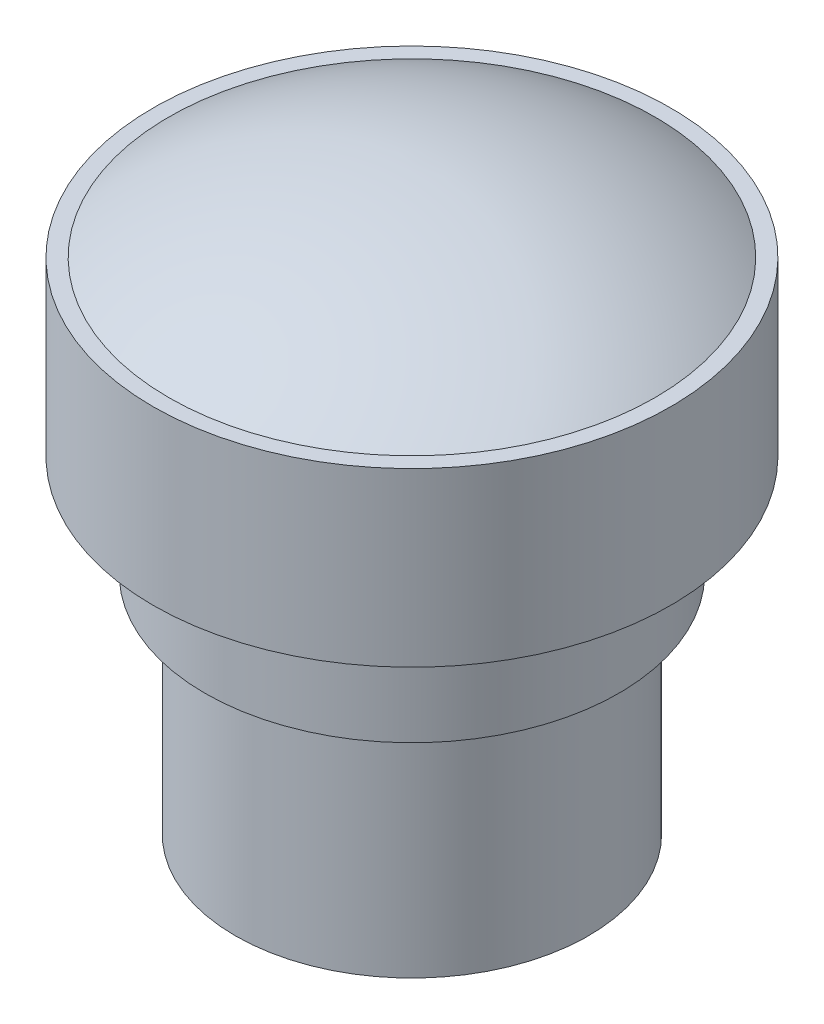
ISO-10303-21;
HEADER;
FILE_DESCRIPTION(('STEP AP214'),'2;1');
FILE_NAME('part.step','',(''),(''),'','','');
FILE_SCHEMA(('AUTOMOTIVE_DESIGN { 1 0 10303 214 1 1 1 1 }'));
ENDSEC;
DATA;
#1=APPLICATION_CONTEXT('core data for automotive mechanical design processes');
#2=APPLICATION_PROTOCOL_DEFINITION('international standard','automotive_design',2000,#1);
#3=PRODUCT_CONTEXT('',#1,'mechanical');
#4=PRODUCT('Part','Part','',(#3));
#5=PRODUCT_RELATED_PRODUCT_CATEGORY('part','',(#4));
#6=PRODUCT_DEFINITION_FORMATION('','',#4);
#7=PRODUCT_DEFINITION_CONTEXT('part definition',#1,'design');
#8=PRODUCT_DEFINITION('design','',#6,#7);
#9=PRODUCT_DEFINITION_SHAPE('','',#8);
#10=(LENGTH_UNIT() NAMED_UNIT(*) SI_UNIT(.MILLI.,.METRE.));
#11=(NAMED_UNIT(*) PLANE_ANGLE_UNIT() SI_UNIT($,.RADIAN.));
#12=(NAMED_UNIT(*) SI_UNIT($,.STERADIAN.) SOLID_ANGLE_UNIT());
#13=UNCERTAINTY_MEASURE_WITH_UNIT(LENGTH_MEASURE(1.E-05),#10,'distance_accuracy_value','');
#14=(GEOMETRIC_REPRESENTATION_CONTEXT(3) GLOBAL_UNCERTAINTY_ASSIGNED_CONTEXT((#13)) GLOBAL_UNIT_ASSIGNED_CONTEXT((#10,
#11,#12)) REPRESENTATION_CONTEXT('',''));
#15=CARTESIAN_POINT('',(0.,0.,0.));
#16=DIRECTION('',(0.,0.,1.));
#17=DIRECTION('',(1.,0.,0.));
#18=AXIS2_PLACEMENT_3D('',#15,#16,#17);
#19=CARTESIAN_POINT('',(0.,0.,0.));
#20=DIRECTION('',(0.,1.,0.));
#21=DIRECTION('',(0.,0.,1.));
#22=AXIS2_PLACEMENT_3D('',#19,#20,#21);
#23=PLANE('',#22);
#24=CARTESIAN_POINT('',(0.,0.,0.));
#25=DIRECTION('',(0.,1.,0.));
#26=DIRECTION('',(0.,0.,1.));
#27=AXIS2_PLACEMENT_3D('',#24,#25,#26);
#28=CIRCLE('',#27,5.8);
#29=CARTESIAN_POINT('',(0.,0.,5.8));
#30=VERTEX_POINT('',#29);
#31=EDGE_CURVE('E10',#30,#30,#28,.T.);
#32=ORIENTED_EDGE('',*,*,#31,.F.);
#33=EDGE_LOOP('',(#32));
#34=FACE_BOUND('',#33,.T.);
#35=ADVANCED_FACE('F41',(#34),#23,.F.);
#36=CARTESIAN_POINT('',(0.,18.9,0.));
#37=DIRECTION('',(0.,1.,0.));
#38=DIRECTION('',(0.,0.,1.));
#39=AXIS2_PLACEMENT_3D('',#36,#37,#38);
#40=CYLINDRICAL_SURFACE('',#39,5.8);
#41=CARTESIAN_POINT('',(0.,7.4,0.));
#42=DIRECTION('',(0.,1.,0.));
#43=DIRECTION('',(0.,0.,1.));
#44=AXIS2_PLACEMENT_3D('',#41,#42,#43);
#45=CIRCLE('',#44,5.8);
#46=CARTESIAN_POINT('',(0.,7.4,5.8));
#47=VERTEX_POINT('',#46);
#48=EDGE_CURVE('E47',#47,#47,#45,.T.);
#49=ORIENTED_EDGE('',*,*,#48,.F.);
#50=EDGE_LOOP('',(#49));
#51=FACE_BOUND('',#50,.T.);
#52=ORIENTED_EDGE('',*,*,#31,.T.);
#53=EDGE_LOOP('',(#52));
#54=FACE_BOUND('',#53,.T.);
#55=ADVANCED_FACE('F98',(#51,#54),#40,.T.);
#56=CARTESIAN_POINT('',(5.8,7.4,0.));
#57=DIRECTION('',(0.,1.,0.));
#58=DIRECTION('',(0.,0.,1.));
#59=AXIS2_PLACEMENT_3D('',#56,#57,#58);
#60=PLANE('',#59);
#61=CARTESIAN_POINT('',(0.,7.4,0.));
#62=DIRECTION('',(0.,1.,0.));
#63=DIRECTION('',(0.,0.,1.));
#64=AXIS2_PLACEMENT_3D('',#61,#62,#63);
#65=CIRCLE('',#64,6.8);
#66=CARTESIAN_POINT('',(0.,7.4,6.8));
#67=VERTEX_POINT('',#66);
#68=EDGE_CURVE('E51',#67,#67,#65,.T.);
#69=ORIENTED_EDGE('',*,*,#68,.F.);
#70=EDGE_LOOP('',(#69));
#71=FACE_BOUND('',#70,.T.);
#72=ORIENTED_EDGE('',*,*,#48,.T.);
#73=EDGE_LOOP('',(#72));
#74=FACE_BOUND('',#73,.T.);
#75=ADVANCED_FACE('F93',(#71,#74),#60,.F.);
#76=CARTESIAN_POINT('',(0.,18.9,0.));
#77=DIRECTION('',(0.,1.,0.));
#78=DIRECTION('',(0.,0.,1.));
#79=AXIS2_PLACEMENT_3D('',#76,#77,#78);
#80=CYLINDRICAL_SURFACE('',#79,6.8);
#81=CARTESIAN_POINT('',(0.,10.75,0.));
#82=DIRECTION('',(0.,1.,0.));
#83=DIRECTION('',(0.,0.,1.));
#84=AXIS2_PLACEMENT_3D('',#81,#82,#83);
#85=CIRCLE('',#84,6.8);
#86=CARTESIAN_POINT('',(0.,10.75,6.8));
#87=VERTEX_POINT('',#86);
#88=EDGE_CURVE('E55',#87,#87,#85,.T.);
#89=ORIENTED_EDGE('',*,*,#88,.F.);
#90=EDGE_LOOP('',(#89));
#91=FACE_BOUND('',#90,.T.);
#92=ORIENTED_EDGE('',*,*,#68,.T.);
#93=EDGE_LOOP('',(#92));
#94=FACE_BOUND('',#93,.T.);
#95=ADVANCED_FACE('F87',(#91,#94),#80,.T.);
#96=CARTESIAN_POINT('',(6.8,10.75,0.));
#97=DIRECTION('',(0.,1.,0.));
#98=DIRECTION('',(0.,0.,1.));
#99=AXIS2_PLACEMENT_3D('',#96,#97,#98);
#100=PLANE('',#99);
#101=CARTESIAN_POINT('',(0.,10.75,0.));
#102=DIRECTION('',(0.,1.,0.));
#103=DIRECTION('',(0.,0.,1.));
#104=AXIS2_PLACEMENT_3D('',#101,#102,#103);
#105=CIRCLE('',#104,8.5);
#106=CARTESIAN_POINT('',(0.,10.75,8.5));
#107=VERTEX_POINT('',#106);
#108=EDGE_CURVE('E60',#107,#107,#105,.T.);
#109=ORIENTED_EDGE('',*,*,#108,.F.);
#110=EDGE_LOOP('',(#109));
#111=FACE_BOUND('',#110,.T.);
#112=ORIENTED_EDGE('',*,*,#88,.T.);
#113=EDGE_LOOP('',(#112));
#114=FACE_BOUND('',#113,.T.);
#115=ADVANCED_FACE('F81',(#111,#114),#100,.F.);
#116=CARTESIAN_POINT('',(0.,18.9,0.));
#117=DIRECTION('',(0.,1.,0.));
#118=DIRECTION('',(0.,0.,1.));
#119=AXIS2_PLACEMENT_3D('',#116,#117,#118);
#120=CYLINDRICAL_SURFACE('',#119,8.5);
#121=CARTESIAN_POINT('',(0.,16.4,0.));
#122=DIRECTION('',(0.,1.,0.));
#123=DIRECTION('',(0.,0.,1.));
#124=AXIS2_PLACEMENT_3D('',#121,#122,#123);
#125=CIRCLE('',#124,8.5);
#126=CARTESIAN_POINT('',(0.,16.4,8.5));
#127=VERTEX_POINT('',#126);
#128=EDGE_CURVE('E63',#127,#127,#125,.T.);
#129=ORIENTED_EDGE('',*,*,#128,.F.);
#130=EDGE_LOOP('',(#129));
#131=FACE_BOUND('',#130,.T.);
#132=ORIENTED_EDGE('',*,*,#108,.T.);
#133=EDGE_LOOP('',(#132));
#134=FACE_BOUND('',#133,.T.);
#135=ADVANCED_FACE('F75',(#131,#134),#120,.T.);
#136=CARTESIAN_POINT('',(8.5,16.4,0.));
#137=DIRECTION('',(0.,-1.,0.));
#138=DIRECTION('',(0.,0.,-1.));
#139=AXIS2_PLACEMENT_3D('',#136,#137,#138);
#140=PLANE('',#139);
#141=CARTESIAN_POINT('',(0.,16.4,0.));
#142=DIRECTION('',(0.,1.,0.));
#143=DIRECTION('',(0.,0.,1.));
#144=AXIS2_PLACEMENT_3D('',#141,#142,#143);
#145=CIRCLE('',#144,7.98435971133566);
#146=CARTESIAN_POINT('',(0.,16.4,7.98435971133566));
#147=VERTEX_POINT('',#146);
#148=EDGE_CURVE('E66',#147,#147,#145,.T.);
#149=ORIENTED_EDGE('',*,*,#148,.F.);
#150=EDGE_LOOP('',(#149));
#151=FACE_BOUND('',#150,.T.);
#152=ORIENTED_EDGE('',*,*,#128,.T.);
#153=EDGE_LOOP('',(#152));
#154=FACE_BOUND('',#153,.T.);
#155=ADVANCED_FACE('F72',(#151,#154),#140,.F.);
#156=CARTESIAN_POINT('',(0.,4.9,0.));
#157=DIRECTION('',(0.,1.,0.));
#158=DIRECTION('',(1.,0.,0.));
#159=AXIS2_PLACEMENT_3D('',#156,#157,#158);
#160=SPHERICAL_SURFACE('',#159,14.);
#161=ORIENTED_EDGE('',*,*,#148,.T.);
#162=EDGE_LOOP('',(#161));
#163=FACE_BOUND('',#162,.T.);
#164=ADVANCED_FACE('F70',(#163),#160,.T.);
#165=CLOSED_SHELL('',(#35,#55,#75,#95,#115,#135,#155,#164));
#166=MANIFOLD_SOLID_BREP('B2',#165);
#167=ADVANCED_BREP_SHAPE_REPRESENTATION('',(#18,#166),#14);
#168=SHAPE_DEFINITION_REPRESENTATION(#9,#167);
ENDSEC;
END-ISO-10303-21;
